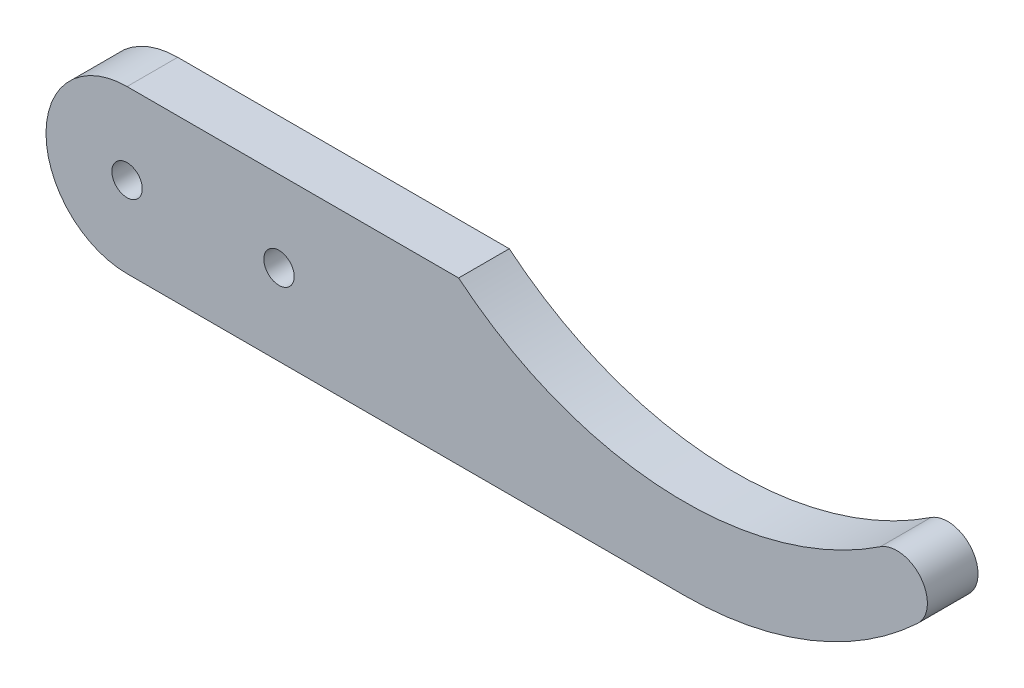
ISO-10303-21;
HEADER;
FILE_DESCRIPTION(('STEP AP214'),'2;1');
FILE_NAME('part.step','',(''),(''),'','','');
FILE_SCHEMA(('AUTOMOTIVE_DESIGN { 1 0 10303 214 1 1 1 1 }'));
ENDSEC;
DATA;
#1=APPLICATION_CONTEXT('core data for automotive mechanical design processes');
#2=APPLICATION_PROTOCOL_DEFINITION('international standard','automotive_design',2000,#1);
#3=PRODUCT_CONTEXT('',#1,'mechanical');
#4=PRODUCT('Part','Part','',(#3));
#5=PRODUCT_RELATED_PRODUCT_CATEGORY('part','',(#4));
#6=PRODUCT_DEFINITION_FORMATION('','',#4);
#7=PRODUCT_DEFINITION_CONTEXT('part definition',#1,'design');
#8=PRODUCT_DEFINITION('design','',#6,#7);
#9=PRODUCT_DEFINITION_SHAPE('','',#8);
#10=(LENGTH_UNIT() NAMED_UNIT(*) SI_UNIT(.MILLI.,.METRE.));
#11=(NAMED_UNIT(*) PLANE_ANGLE_UNIT() SI_UNIT($,.RADIAN.));
#12=(NAMED_UNIT(*) SI_UNIT($,.STERADIAN.) SOLID_ANGLE_UNIT());
#13=UNCERTAINTY_MEASURE_WITH_UNIT(LENGTH_MEASURE(1.E-05),#10,'distance_accuracy_value','');
#14=(GEOMETRIC_REPRESENTATION_CONTEXT(3) GLOBAL_UNCERTAINTY_ASSIGNED_CONTEXT((#13)) GLOBAL_UNIT_ASSIGNED_CONTEXT((#10,
#11,#12)) REPRESENTATION_CONTEXT('',''));
#15=CARTESIAN_POINT('',(0.,0.,0.));
#16=DIRECTION('',(0.,0.,1.));
#17=DIRECTION('',(1.,0.,0.));
#18=AXIS2_PLACEMENT_3D('',#15,#16,#17);
#19=CARTESIAN_POINT('',(-15.,0.,5.));
#20=DIRECTION('',(0.,0.,1.));
#21=DIRECTION('',(1.,0.,0.));
#22=AXIS2_PLACEMENT_3D('',#19,#20,#21);
#23=PLANE('',#22);
#24=CARTESIAN_POINT('',(0.,0.,5.));
#25=DIRECTION('',(0.,0.,1.));
#26=DIRECTION('',(1.,0.,0.));
#27=AXIS2_PLACEMENT_3D('',#24,#25,#26);
#28=CIRCLE('',#27,1.5);
#29=CARTESIAN_POINT('',(1.5,0.,5.));
#30=VERTEX_POINT('',#29);
#31=EDGE_CURVE('E126',#30,#30,#28,.T.);
#32=ORIENTED_EDGE('',*,*,#31,.F.);
#33=EDGE_LOOP('',(#32));
#34=FACE_BOUND('',#33,.T.);
#35=DIRECTION('',(-1.,0.,0.));
#36=VECTOR('',#35,1.);
#37=CARTESIAN_POINT('',(0.,8.,5.));
#38=LINE('',#37,#36);
#39=CARTESIAN_POINT('',(17.7289425486799,8.,5.));
#40=VERTEX_POINT('',#39);
#41=CARTESIAN_POINT('',(-15.,8.,5.));
#42=VERTEX_POINT('',#41);
#43=EDGE_CURVE('E50',#40,#42,#38,.T.);
#44=ORIENTED_EDGE('',*,*,#43,.T.);
#45=CARTESIAN_POINT('',(-15.,0.,5.));
#46=DIRECTION('',(0.,0.,1.));
#47=DIRECTION('',(1.,0.,0.));
#48=AXIS2_PLACEMENT_3D('',#45,#46,#47);
#49=CIRCLE('',#48,8.);
#50=CARTESIAN_POINT('',(-15.,-8.,5.));
#51=VERTEX_POINT('',#50);
#52=EDGE_CURVE('E88',#42,#51,#49,.T.);
#53=ORIENTED_EDGE('',*,*,#52,.T.);
#54=DIRECTION('',(1.,0.,0.));
#55=VECTOR('',#54,1.);
#56=CARTESIAN_POINT('',(0.,-8.,5.));
#57=LINE('',#56,#55);
#58=CARTESIAN_POINT('',(40.,-8.,5.));
#59=VERTEX_POINT('',#58);
#60=EDGE_CURVE('E102',#51,#59,#57,.T.);
#61=ORIENTED_EDGE('',*,*,#60,.T.);
#62=CARTESIAN_POINT('',(40.,25.6360575057795,5.));
#63=DIRECTION('',(0.,0.,1.));
#64=DIRECTION('',(1.,0.,0.));
#65=AXIS2_PLACEMENT_3D('',#62,#63,#64);
#66=CIRCLE('',#65,33.6360575057795);
#67=CARTESIAN_POINT('',(63.056400370319,1.145513075415,5.));
#68=VERTEX_POINT('',#67);
#69=EDGE_CURVE('E96',#59,#68,#66,.T.);
#70=ORIENTED_EDGE('',*,*,#69,.T.);
#71=CARTESIAN_POINT('',(61.,3.32982475577377,5.));
#72=DIRECTION('',(0.,0.,1.));
#73=DIRECTION('',(-1.,0.,0.));
#74=AXIS2_PLACEMENT_3D('',#71,#72,#73);
#75=CIRCLE('',#74,3.00000000000001);
#76=CARTESIAN_POINT('',(59.3421052631579,5.83010174873899,5.));
#77=VERTEX_POINT('',#76);
#78=EDGE_CURVE('E100',#68,#77,#75,.T.);
#79=ORIENTED_EDGE('',*,*,#78,.T.);
#80=CARTESIAN_POINT('',(40.,35.,5.));
#81=DIRECTION('',(0.,0.,-1.));
#82=DIRECTION('',(1.,0.,0.));
#83=AXIS2_PLACEMENT_3D('',#80,#81,#82);
#84=CIRCLE('',#83,35.);
#85=EDGE_CURVE('E116',#77,#40,#84,.T.);
#86=ORIENTED_EDGE('',*,*,#85,.T.);
#87=EDGE_LOOP('',(#44,#53,#61,#70,#79,#86));
#88=FACE_BOUND('',#87,.T.);
#89=CARTESIAN_POINT('',(-15.,0.,5.));
#90=DIRECTION('',(0.,0.,1.));
#91=DIRECTION('',(1.,0.,0.));
#92=AXIS2_PLACEMENT_3D('',#89,#90,#91);
#93=CIRCLE('',#92,1.5);
#94=CARTESIAN_POINT('',(-13.5,0.,5.));
#95=VERTEX_POINT('',#94);
#96=EDGE_CURVE('E151',#95,#95,#93,.T.);
#97=ORIENTED_EDGE('',*,*,#96,.F.);
#98=EDGE_LOOP('',(#97));
#99=FACE_BOUND('',#98,.T.);
#100=ADVANCED_FACE('F33',(#34,#88,#99),#23,.T.);
#101=CARTESIAN_POINT('',(-15.,0.,0.));
#102=DIRECTION('',(0.,0.,1.));
#103=DIRECTION('',(1.,0.,0.));
#104=AXIS2_PLACEMENT_3D('',#101,#102,#103);
#105=PLANE('',#104);
#106=CARTESIAN_POINT('',(0.,0.,0.));
#107=DIRECTION('',(0.,0.,1.));
#108=DIRECTION('',(1.,0.,0.));
#109=AXIS2_PLACEMENT_3D('',#106,#107,#108);
#110=CIRCLE('',#109,1.5);
#111=CARTESIAN_POINT('',(1.5,0.,0.));
#112=VERTEX_POINT('',#111);
#113=EDGE_CURVE('E148',#112,#112,#110,.T.);
#114=ORIENTED_EDGE('',*,*,#113,.T.);
#115=EDGE_LOOP('',(#114));
#116=FACE_BOUND('',#115,.T.);
#117=CARTESIAN_POINT('',(-15.,0.,0.));
#118=DIRECTION('',(0.,0.,1.));
#119=DIRECTION('',(1.,0.,0.));
#120=AXIS2_PLACEMENT_3D('',#117,#118,#119);
#121=CIRCLE('',#120,8.);
#122=CARTESIAN_POINT('',(-15.,8.,0.));
#123=VERTEX_POINT('',#122);
#124=CARTESIAN_POINT('',(-15.,-8.,0.));
#125=VERTEX_POINT('',#124);
#126=EDGE_CURVE('E122',#123,#125,#121,.T.);
#127=ORIENTED_EDGE('',*,*,#126,.F.);
#128=DIRECTION('',(-1.,0.,0.));
#129=VECTOR('',#128,1.);
#130=CARTESIAN_POINT('',(0.,8.,0.));
#131=LINE('',#130,#129);
#132=CARTESIAN_POINT('',(17.7289425486799,8.,0.));
#133=VERTEX_POINT('',#132);
#134=EDGE_CURVE('E131',#133,#123,#131,.T.);
#135=ORIENTED_EDGE('',*,*,#134,.F.);
#136=CARTESIAN_POINT('',(40.,35.,0.));
#137=DIRECTION('',(0.,0.,-1.));
#138=DIRECTION('',(1.,0.,0.));
#139=AXIS2_PLACEMENT_3D('',#136,#137,#138);
#140=CIRCLE('',#139,35.);
#141=CARTESIAN_POINT('',(59.3421052631579,5.83010174873899,0.));
#142=VERTEX_POINT('',#141);
#143=EDGE_CURVE('E81',#142,#133,#140,.T.);
#144=ORIENTED_EDGE('',*,*,#143,.F.);
#145=CARTESIAN_POINT('',(61.,3.32982475577377,0.));
#146=DIRECTION('',(0.,0.,1.));
#147=DIRECTION('',(-1.,0.,0.));
#148=AXIS2_PLACEMENT_3D('',#145,#146,#147);
#149=CIRCLE('',#148,3.00000000000001);
#150=CARTESIAN_POINT('',(63.056400370319,1.145513075415,0.));
#151=VERTEX_POINT('',#150);
#152=EDGE_CURVE('E74',#151,#142,#149,.T.);
#153=ORIENTED_EDGE('',*,*,#152,.F.);
#154=CARTESIAN_POINT('',(40.,25.6360575057795,0.));
#155=DIRECTION('',(0.,0.,1.));
#156=DIRECTION('',(1.,0.,0.));
#157=AXIS2_PLACEMENT_3D('',#154,#155,#156);
#158=CIRCLE('',#157,33.6360575057795);
#159=CARTESIAN_POINT('',(40.,-8.,0.));
#160=VERTEX_POINT('',#159);
#161=EDGE_CURVE('E110',#160,#151,#158,.T.);
#162=ORIENTED_EDGE('',*,*,#161,.F.);
#163=DIRECTION('',(1.,0.,0.));
#164=VECTOR('',#163,1.);
#165=CARTESIAN_POINT('',(0.,-8.,0.));
#166=LINE('',#165,#164);
#167=EDGE_CURVE('E125',#125,#160,#166,.T.);
#168=ORIENTED_EDGE('',*,*,#167,.F.);
#169=EDGE_LOOP('',(#127,#135,#144,#153,#162,#168));
#170=FACE_BOUND('',#169,.T.);
#171=CARTESIAN_POINT('',(-15.,0.,0.));
#172=DIRECTION('',(0.,0.,1.));
#173=DIRECTION('',(1.,0.,0.));
#174=AXIS2_PLACEMENT_3D('',#171,#172,#173);
#175=CIRCLE('',#174,1.5);
#176=CARTESIAN_POINT('',(-13.5,0.,0.));
#177=VERTEX_POINT('',#176);
#178=EDGE_CURVE('E154',#177,#177,#175,.T.);
#179=ORIENTED_EDGE('',*,*,#178,.T.);
#180=EDGE_LOOP('',(#179));
#181=FACE_BOUND('',#180,.T.);
#182=ADVANCED_FACE('F141',(#116,#170,#181),#105,.F.);
#183=CARTESIAN_POINT('',(-15.,0.,5.));
#184=DIRECTION('',(0.,0.,-1.));
#185=DIRECTION('',(-1.,0.,0.));
#186=AXIS2_PLACEMENT_3D('',#183,#184,#185);
#187=CYLINDRICAL_SURFACE('',#186,8.);
#188=ORIENTED_EDGE('',*,*,#126,.T.);
#189=DIRECTION('',(0.,0.,-1.));
#190=VECTOR('',#189,1.);
#191=CARTESIAN_POINT('',(-15.,-8.,5.));
#192=LINE('',#191,#190);
#193=EDGE_CURVE('E42',#51,#125,#192,.T.);
#194=ORIENTED_EDGE('',*,*,#193,.F.);
#195=ORIENTED_EDGE('',*,*,#52,.F.);
#196=DIRECTION('',(0.,0.,-1.));
#197=VECTOR('',#196,1.);
#198=CARTESIAN_POINT('',(-15.,8.,5.));
#199=LINE('',#198,#197);
#200=EDGE_CURVE('E11',#42,#123,#199,.T.);
#201=ORIENTED_EDGE('',*,*,#200,.T.);
#202=EDGE_LOOP('',(#188,#194,#195,#201));
#203=FACE_BOUND('',#202,.T.);
#204=ADVANCED_FACE('F35',(#203),#187,.T.);
#205=CARTESIAN_POINT('',(0.,-8.,5.));
#206=DIRECTION('',(0.,1.,0.));
#207=DIRECTION('',(0.,0.,1.));
#208=AXIS2_PLACEMENT_3D('',#205,#206,#207);
#209=PLANE('',#208);
#210=ORIENTED_EDGE('',*,*,#167,.T.);
#211=DIRECTION('',(0.,0.,-1.));
#212=VECTOR('',#211,1.);
#213=CARTESIAN_POINT('',(40.,-8.,5.));
#214=LINE('',#213,#212);
#215=EDGE_CURVE('E111',#59,#160,#214,.T.);
#216=ORIENTED_EDGE('',*,*,#215,.F.);
#217=ORIENTED_EDGE('',*,*,#60,.F.);
#218=ORIENTED_EDGE('',*,*,#193,.T.);
#219=EDGE_LOOP('',(#210,#216,#217,#218));
#220=FACE_BOUND('',#219,.T.);
#221=ADVANCED_FACE('F137',(#220),#209,.F.);
#222=CARTESIAN_POINT('',(40.,25.6360575057795,5.));
#223=DIRECTION('',(0.,0.,-1.));
#224=DIRECTION('',(-1.,0.,0.));
#225=AXIS2_PLACEMENT_3D('',#222,#223,#224);
#226=CYLINDRICAL_SURFACE('',#225,33.6360575057795);
#227=ORIENTED_EDGE('',*,*,#161,.T.);
#228=DIRECTION('',(0.,0.,-1.));
#229=VECTOR('',#228,1.);
#230=CARTESIAN_POINT('',(63.056400370319,1.145513075415,5.));
#231=LINE('',#230,#229);
#232=EDGE_CURVE('E107',#68,#151,#231,.T.);
#233=ORIENTED_EDGE('',*,*,#232,.F.);
#234=ORIENTED_EDGE('',*,*,#69,.F.);
#235=ORIENTED_EDGE('',*,*,#215,.T.);
#236=EDGE_LOOP('',(#227,#233,#234,#235));
#237=FACE_BOUND('',#236,.T.);
#238=ADVANCED_FACE('F108',(#237),#226,.T.);
#239=CARTESIAN_POINT('',(61.,3.32982475577377,5.));
#240=DIRECTION('',(0.,0.,-1.));
#241=DIRECTION('',(-1.,0.,0.));
#242=AXIS2_PLACEMENT_3D('',#239,#240,#241);
#243=CYLINDRICAL_SURFACE('',#242,3.00000000000001);
#244=ORIENTED_EDGE('',*,*,#152,.T.);
#245=DIRECTION('',(0.,0.,-1.));
#246=VECTOR('',#245,1.);
#247=CARTESIAN_POINT('',(59.3421052631579,5.83010174873899,5.));
#248=LINE('',#247,#246);
#249=EDGE_CURVE('E112',#77,#142,#248,.T.);
#250=ORIENTED_EDGE('',*,*,#249,.F.);
#251=ORIENTED_EDGE('',*,*,#78,.F.);
#252=ORIENTED_EDGE('',*,*,#232,.T.);
#253=EDGE_LOOP('',(#244,#250,#251,#252));
#254=FACE_BOUND('',#253,.T.);
#255=ADVANCED_FACE('F114',(#254),#243,.T.);
#256=CARTESIAN_POINT('',(40.,35.,5.));
#257=DIRECTION('',(0.,0.,-1.));
#258=DIRECTION('',(-1.,0.,0.));
#259=AXIS2_PLACEMENT_3D('',#256,#257,#258);
#260=CYLINDRICAL_SURFACE('',#259,35.);
#261=ORIENTED_EDGE('',*,*,#143,.T.);
#262=DIRECTION('',(0.,0.,-1.));
#263=VECTOR('',#262,1.);
#264=CARTESIAN_POINT('',(17.7289425486799,8.,5.));
#265=LINE('',#264,#263);
#266=EDGE_CURVE('E118',#40,#133,#265,.T.);
#267=ORIENTED_EDGE('',*,*,#266,.F.);
#268=ORIENTED_EDGE('',*,*,#85,.F.);
#269=ORIENTED_EDGE('',*,*,#249,.T.);
#270=EDGE_LOOP('',(#261,#267,#268,#269));
#271=FACE_BOUND('',#270,.T.);
#272=ADVANCED_FACE('F144',(#271),#260,.F.);
#273=CARTESIAN_POINT('',(0.,8.,5.));
#274=DIRECTION('',(0.,-1.,0.));
#275=DIRECTION('',(0.,0.,-1.));
#276=AXIS2_PLACEMENT_3D('',#273,#274,#275);
#277=PLANE('',#276);
#278=ORIENTED_EDGE('',*,*,#134,.T.);
#279=ORIENTED_EDGE('',*,*,#200,.F.);
#280=ORIENTED_EDGE('',*,*,#43,.F.);
#281=ORIENTED_EDGE('',*,*,#266,.T.);
#282=EDGE_LOOP('',(#278,#279,#280,#281));
#283=FACE_BOUND('',#282,.T.);
#284=ADVANCED_FACE('F143',(#283),#277,.F.);
#285=CARTESIAN_POINT('',(0.,0.,5.));
#286=DIRECTION('',(0.,0.,-1.));
#287=DIRECTION('',(-1.,0.,0.));
#288=AXIS2_PLACEMENT_3D('',#285,#286,#287);
#289=CYLINDRICAL_SURFACE('',#288,1.5);
#290=ORIENTED_EDGE('',*,*,#31,.T.);
#291=EDGE_LOOP('',(#290));
#292=FACE_BOUND('',#291,.T.);
#293=ORIENTED_EDGE('',*,*,#113,.F.);
#294=EDGE_LOOP('',(#293));
#295=FACE_BOUND('',#294,.T.);
#296=ADVANCED_FACE('F172',(#292,#295),#289,.F.);
#297=CARTESIAN_POINT('',(-15.,0.,5.));
#298=DIRECTION('',(0.,0.,-1.));
#299=DIRECTION('',(-1.,0.,0.));
#300=AXIS2_PLACEMENT_3D('',#297,#298,#299);
#301=CYLINDRICAL_SURFACE('',#300,1.5);
#302=ORIENTED_EDGE('',*,*,#96,.T.);
#303=EDGE_LOOP('',(#302));
#304=FACE_BOUND('',#303,.T.);
#305=ORIENTED_EDGE('',*,*,#178,.F.);
#306=EDGE_LOOP('',(#305));
#307=FACE_BOUND('',#306,.T.);
#308=ADVANCED_FACE('F160',(#304,#307),#301,.F.);
#309=CLOSED_SHELL('',(#100,#182,#204,#221,#238,#255,#272,#284,#296,#308));
#310=MANIFOLD_SOLID_BREP('B2',#309);
#311=ADVANCED_BREP_SHAPE_REPRESENTATION('',(#18,#310),#14);
#312=SHAPE_DEFINITION_REPRESENTATION(#9,#311);
ENDSEC;
END-ISO-10303-21;
